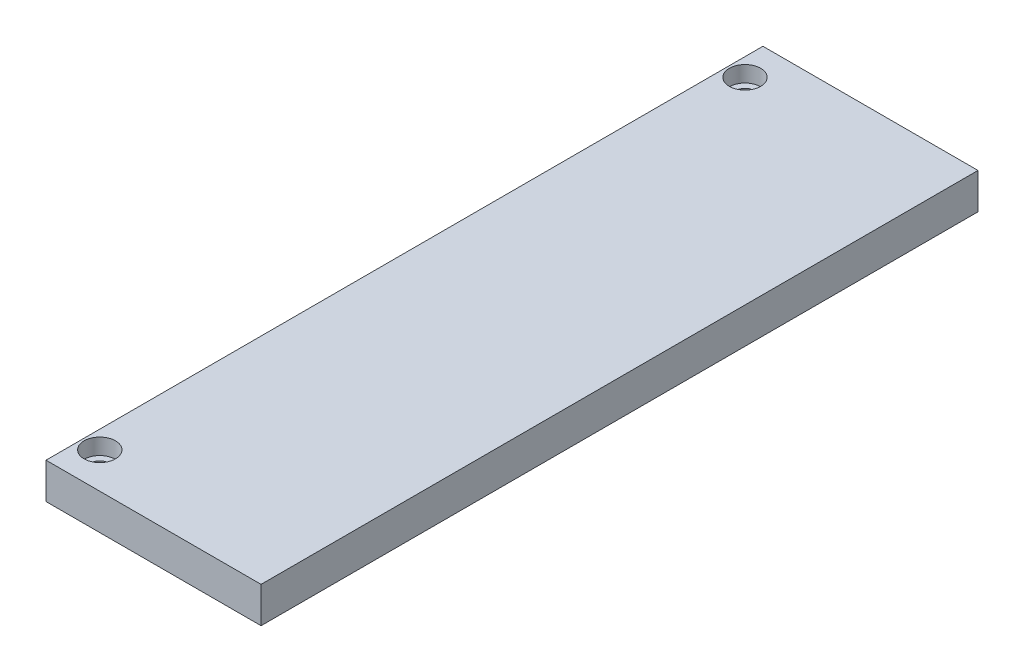
ISO-10303-21;
HEADER;
FILE_DESCRIPTION(('STEP AP214'),'2;1');
FILE_NAME('part.step','',(''),(''),'','','');
FILE_SCHEMA(('AUTOMOTIVE_DESIGN { 1 0 10303 214 1 1 1 1 }'));
ENDSEC;
DATA;
#1=APPLICATION_CONTEXT('core data for automotive mechanical design processes');
#2=APPLICATION_PROTOCOL_DEFINITION('international standard','automotive_design',2000,#1);
#3=PRODUCT_CONTEXT('',#1,'mechanical');
#4=PRODUCT('Part','Part','',(#3));
#5=PRODUCT_RELATED_PRODUCT_CATEGORY('part','',(#4));
#6=PRODUCT_DEFINITION_FORMATION('','',#4);
#7=PRODUCT_DEFINITION_CONTEXT('part definition',#1,'design');
#8=PRODUCT_DEFINITION('design','',#6,#7);
#9=PRODUCT_DEFINITION_SHAPE('','',#8);
#10=(LENGTH_UNIT() NAMED_UNIT(*) SI_UNIT(.MILLI.,.METRE.));
#11=(NAMED_UNIT(*) PLANE_ANGLE_UNIT() SI_UNIT($,.RADIAN.));
#12=(NAMED_UNIT(*) SI_UNIT($,.STERADIAN.) SOLID_ANGLE_UNIT());
#13=UNCERTAINTY_MEASURE_WITH_UNIT(LENGTH_MEASURE(1.E-05),#10,'distance_accuracy_value','');
#14=(GEOMETRIC_REPRESENTATION_CONTEXT(3) GLOBAL_UNCERTAINTY_ASSIGNED_CONTEXT((#13)) GLOBAL_UNIT_ASSIGNED_CONTEXT((#10,
#11,#12)) REPRESENTATION_CONTEXT('',''));
#15=CARTESIAN_POINT('',(0.,0.,0.));
#16=DIRECTION('',(0.,0.,1.));
#17=DIRECTION('',(1.,0.,0.));
#18=AXIS2_PLACEMENT_3D('',#15,#16,#17);
#19=CARTESIAN_POINT('',(19.05,6.35,63.5));
#20=DIRECTION('',(-1.,0.,0.));
#21=DIRECTION('',(0.,0.,1.));
#22=AXIS2_PLACEMENT_3D('',#19,#20,#21);
#23=PLANE('',#22);
#24=DIRECTION('',(0.,0.,-1.));
#25=VECTOR('',#24,1.);
#26=CARTESIAN_POINT('',(19.05,0.,63.5));
#27=LINE('',#26,#25);
#28=CARTESIAN_POINT('',(19.05,0.,63.5));
#29=VERTEX_POINT('',#28);
#30=CARTESIAN_POINT('',(19.05,0.,-63.5));
#31=VERTEX_POINT('',#30);
#32=EDGE_CURVE('E106',#29,#31,#27,.T.);
#33=ORIENTED_EDGE('',*,*,#32,.T.);
#34=DIRECTION('',(0.,-1.,0.));
#35=VECTOR('',#34,1.);
#36=CARTESIAN_POINT('',(19.05,6.35,-63.5));
#37=LINE('',#36,#35);
#38=CARTESIAN_POINT('',(19.05,6.35,-63.5));
#39=VERTEX_POINT('',#38);
#40=EDGE_CURVE('E11',#39,#31,#37,.T.);
#41=ORIENTED_EDGE('',*,*,#40,.F.);
#42=DIRECTION('',(0.,0.,-1.));
#43=VECTOR('',#42,1.);
#44=CARTESIAN_POINT('',(19.05,6.35,63.5));
#45=LINE('',#44,#43);
#46=CARTESIAN_POINT('',(19.05,6.35,63.5));
#47=VERTEX_POINT('',#46);
#48=EDGE_CURVE('E90',#47,#39,#45,.T.);
#49=ORIENTED_EDGE('',*,*,#48,.F.);
#50=DIRECTION('',(0.,-1.,0.));
#51=VECTOR('',#50,1.);
#52=CARTESIAN_POINT('',(19.05,6.35,63.5));
#53=LINE('',#52,#51);
#54=EDGE_CURVE('E102',#47,#29,#53,.T.);
#55=ORIENTED_EDGE('',*,*,#54,.T.);
#56=EDGE_LOOP('',(#33,#41,#49,#55));
#57=FACE_BOUND('',#56,.T.);
#58=ADVANCED_FACE('F38',(#57),#23,.F.);
#59=CARTESIAN_POINT('',(-19.05,6.35,-63.5));
#60=DIRECTION('',(0.,0.,1.));
#61=DIRECTION('',(1.,0.,0.));
#62=AXIS2_PLACEMENT_3D('',#59,#60,#61);
#63=PLANE('',#62);
#64=DIRECTION('',(-1.,0.,0.));
#65=VECTOR('',#64,1.);
#66=CARTESIAN_POINT('',(-19.05,0.,-63.5));
#67=LINE('',#66,#65);
#68=CARTESIAN_POINT('',(-19.05,0.,-63.5));
#69=VERTEX_POINT('',#68);
#70=EDGE_CURVE('E95',#31,#69,#67,.T.);
#71=ORIENTED_EDGE('',*,*,#70,.T.);
#72=DIRECTION('',(0.,-1.,0.));
#73=VECTOR('',#72,1.);
#74=CARTESIAN_POINT('',(-19.05,6.35,-63.5));
#75=LINE('',#74,#73);
#76=CARTESIAN_POINT('',(-19.05,6.35,-63.5));
#77=VERTEX_POINT('',#76);
#78=EDGE_CURVE('E47',#77,#69,#75,.T.);
#79=ORIENTED_EDGE('',*,*,#78,.F.);
#80=DIRECTION('',(-1.,0.,0.));
#81=VECTOR('',#80,1.);
#82=CARTESIAN_POINT('',(-19.05,6.35,-63.5));
#83=LINE('',#82,#81);
#84=EDGE_CURVE('E85',#39,#77,#83,.T.);
#85=ORIENTED_EDGE('',*,*,#84,.F.);
#86=ORIENTED_EDGE('',*,*,#40,.T.);
#87=EDGE_LOOP('',(#71,#79,#85,#86));
#88=FACE_BOUND('',#87,.T.);
#89=ADVANCED_FACE('F94',(#88),#63,.F.);
#90=CARTESIAN_POINT('',(-19.05,6.35,63.5));
#91=DIRECTION('',(1.,0.,0.));
#92=DIRECTION('',(0.,0.,-1.));
#93=AXIS2_PLACEMENT_3D('',#90,#91,#92);
#94=PLANE('',#93);
#95=DIRECTION('',(0.,0.,1.));
#96=VECTOR('',#95,1.);
#97=CARTESIAN_POINT('',(-19.05,0.,63.5));
#98=LINE('',#97,#96);
#99=CARTESIAN_POINT('',(-19.05,0.,63.5));
#100=VERTEX_POINT('',#99);
#101=EDGE_CURVE('E72',#69,#100,#98,.T.);
#102=ORIENTED_EDGE('',*,*,#101,.T.);
#103=DIRECTION('',(0.,-1.,0.));
#104=VECTOR('',#103,1.);
#105=CARTESIAN_POINT('',(-19.05,6.35,63.5));
#106=LINE('',#105,#104);
#107=CARTESIAN_POINT('',(-19.05,6.35,63.5));
#108=VERTEX_POINT('',#107);
#109=EDGE_CURVE('E97',#108,#100,#106,.T.);
#110=ORIENTED_EDGE('',*,*,#109,.F.);
#111=DIRECTION('',(0.,0.,1.));
#112=VECTOR('',#111,1.);
#113=CARTESIAN_POINT('',(-19.05,6.35,63.5));
#114=LINE('',#113,#112);
#115=EDGE_CURVE('E88',#77,#108,#114,.T.);
#116=ORIENTED_EDGE('',*,*,#115,.F.);
#117=ORIENTED_EDGE('',*,*,#78,.T.);
#118=EDGE_LOOP('',(#102,#110,#116,#117));
#119=FACE_BOUND('',#118,.T.);
#120=ADVANCED_FACE('F98',(#119),#94,.F.);
#121=CARTESIAN_POINT('',(-19.05,6.35,63.5));
#122=DIRECTION('',(0.,0.,-1.));
#123=DIRECTION('',(-1.,0.,0.));
#124=AXIS2_PLACEMENT_3D('',#121,#122,#123);
#125=PLANE('',#124);
#126=DIRECTION('',(1.,0.,0.));
#127=VECTOR('',#126,1.);
#128=CARTESIAN_POINT('',(-19.05,0.,63.5));
#129=LINE('',#128,#127);
#130=EDGE_CURVE('E78',#100,#29,#129,.T.);
#131=ORIENTED_EDGE('',*,*,#130,.T.);
#132=ORIENTED_EDGE('',*,*,#54,.F.);
#133=DIRECTION('',(1.,0.,0.));
#134=VECTOR('',#133,1.);
#135=CARTESIAN_POINT('',(-19.05,6.35,63.5));
#136=LINE('',#135,#134);
#137=EDGE_CURVE('E55',#108,#47,#136,.T.);
#138=ORIENTED_EDGE('',*,*,#137,.F.);
#139=ORIENTED_EDGE('',*,*,#109,.T.);
#140=EDGE_LOOP('',(#131,#132,#138,#139));
#141=FACE_BOUND('',#140,.T.);
#142=ADVANCED_FACE('F120',(#141),#125,.F.);
#143=CARTESIAN_POINT('',(0.,6.35,0.));
#144=DIRECTION('',(0.,-1.,0.));
#145=DIRECTION('',(0.,0.,-1.));
#146=AXIS2_PLACEMENT_3D('',#143,#144,#145);
#147=PLANE('',#146);
#148=CARTESIAN_POINT('',(-15.875,6.35,57.15));
#149=DIRECTION('',(0.,1.,0.));
#150=DIRECTION('',(0.,0.,1.));
#151=AXIS2_PLACEMENT_3D('',#148,#149,#150);
#152=CIRCLE('',#151,2.77876);
#153=CARTESIAN_POINT('',(-15.875,6.35,59.92876));
#154=VERTEX_POINT('',#153);
#155=EDGE_CURVE('E154',#154,#154,#152,.T.);
#156=ORIENTED_EDGE('',*,*,#155,.F.);
#157=EDGE_LOOP('',(#156));
#158=FACE_BOUND('',#157,.T.);
#159=CARTESIAN_POINT('',(-15.875,6.35,-57.15));
#160=DIRECTION('',(0.,1.,0.));
#161=DIRECTION('',(0.,0.,1.));
#162=AXIS2_PLACEMENT_3D('',#159,#160,#161);
#163=CIRCLE('',#162,2.77876);
#164=CARTESIAN_POINT('',(-15.875,6.35,-54.37124));
#165=VERTEX_POINT('',#164);
#166=EDGE_CURVE('E138',#165,#165,#163,.T.);
#167=ORIENTED_EDGE('',*,*,#166,.F.);
#168=EDGE_LOOP('',(#167));
#169=FACE_BOUND('',#168,.T.);
#170=ORIENTED_EDGE('',*,*,#48,.T.);
#171=ORIENTED_EDGE('',*,*,#84,.T.);
#172=ORIENTED_EDGE('',*,*,#115,.T.);
#173=ORIENTED_EDGE('',*,*,#137,.T.);
#174=EDGE_LOOP('',(#170,#171,#172,#173));
#175=FACE_BOUND('',#174,.T.);
#176=ADVANCED_FACE('F86',(#158,#169,#175),#147,.F.);
#177=CARTESIAN_POINT('',(0.,0.,0.));
#178=DIRECTION('',(0.,-1.,0.));
#179=DIRECTION('',(0.,0.,-1.));
#180=AXIS2_PLACEMENT_3D('',#177,#178,#179);
#181=PLANE('',#180);
#182=CARTESIAN_POINT('',(-15.875,0.,57.15));
#183=DIRECTION('',(0.,1.,0.));
#184=DIRECTION('',(0.,0.,1.));
#185=AXIS2_PLACEMENT_3D('',#182,#183,#184);
#186=CIRCLE('',#185,1.63195);
#187=CARTESIAN_POINT('',(-15.875,0.,58.78195));
#188=VERTEX_POINT('',#187);
#189=EDGE_CURVE('E142',#188,#188,#186,.T.);
#190=ORIENTED_EDGE('',*,*,#189,.T.);
#191=EDGE_LOOP('',(#190));
#192=FACE_BOUND('',#191,.T.);
#193=CARTESIAN_POINT('',(-15.875,0.,-57.15));
#194=DIRECTION('',(0.,1.,0.));
#195=DIRECTION('',(0.,0.,1.));
#196=AXIS2_PLACEMENT_3D('',#193,#194,#195);
#197=CIRCLE('',#196,1.63195);
#198=CARTESIAN_POINT('',(-15.875,0.,-55.51805));
#199=VERTEX_POINT('',#198);
#200=EDGE_CURVE('E110',#199,#199,#197,.T.);
#201=ORIENTED_EDGE('',*,*,#200,.T.);
#202=EDGE_LOOP('',(#201));
#203=FACE_BOUND('',#202,.T.);
#204=ORIENTED_EDGE('',*,*,#32,.F.);
#205=ORIENTED_EDGE('',*,*,#130,.F.);
#206=ORIENTED_EDGE('',*,*,#101,.F.);
#207=ORIENTED_EDGE('',*,*,#70,.F.);
#208=EDGE_LOOP('',(#204,#205,#206,#207));
#209=FACE_BOUND('',#208,.T.);
#210=ADVANCED_FACE('F123',(#192,#203,#209),#181,.T.);
#211=CARTESIAN_POINT('',(-15.875,6.35,-57.15));
#212=DIRECTION('',(0.,1.,0.));
#213=DIRECTION('',(0.,0.,1.));
#214=AXIS2_PLACEMENT_3D('',#211,#212,#213);
#215=CYLINDRICAL_SURFACE('',#214,1.63195);
#216=ORIENTED_EDGE('',*,*,#200,.F.);
#217=EDGE_LOOP('',(#216));
#218=FACE_BOUND('',#217,.T.);
#219=CARTESIAN_POINT('',(-15.875,3.5052,-57.15));
#220=DIRECTION('',(0.,1.,0.));
#221=DIRECTION('',(0.,0.,1.));
#222=AXIS2_PLACEMENT_3D('',#219,#220,#221);
#223=CIRCLE('',#222,1.63195);
#224=CARTESIAN_POINT('',(-15.875,3.5052,-55.51805));
#225=VERTEX_POINT('',#224);
#226=EDGE_CURVE('E130',#225,#225,#223,.T.);
#227=ORIENTED_EDGE('',*,*,#226,.T.);
#228=EDGE_LOOP('',(#227));
#229=FACE_BOUND('',#228,.T.);
#230=ADVANCED_FACE('F179',(#218,#229),#215,.F.);
#231=CARTESIAN_POINT('',(-14.24305,3.5052,-57.15));
#232=DIRECTION('',(0.,-1.,0.));
#233=DIRECTION('',(0.,0.,-1.));
#234=AXIS2_PLACEMENT_3D('',#231,#232,#233);
#235=PLANE('',#234);
#236=ORIENTED_EDGE('',*,*,#226,.F.);
#237=EDGE_LOOP('',(#236));
#238=FACE_BOUND('',#237,.T.);
#239=CARTESIAN_POINT('',(-15.875,3.5052,-57.15));
#240=DIRECTION('',(0.,1.,0.));
#241=DIRECTION('',(0.,0.,1.));
#242=AXIS2_PLACEMENT_3D('',#239,#240,#241);
#243=CIRCLE('',#242,2.77876);
#244=CARTESIAN_POINT('',(-15.875,3.5052,-54.37124));
#245=VERTEX_POINT('',#244);
#246=EDGE_CURVE('E134',#245,#245,#243,.T.);
#247=ORIENTED_EDGE('',*,*,#246,.T.);
#248=EDGE_LOOP('',(#247));
#249=FACE_BOUND('',#248,.T.);
#250=ADVANCED_FACE('F169',(#238,#249),#235,.F.);
#251=CARTESIAN_POINT('',(-15.875,6.35,-57.15));
#252=DIRECTION('',(0.,1.,0.));
#253=DIRECTION('',(0.,0.,1.));
#254=AXIS2_PLACEMENT_3D('',#251,#252,#253);
#255=CYLINDRICAL_SURFACE('',#254,2.77876);
#256=ORIENTED_EDGE('',*,*,#246,.F.);
#257=EDGE_LOOP('',(#256));
#258=FACE_BOUND('',#257,.T.);
#259=ORIENTED_EDGE('',*,*,#166,.T.);
#260=EDGE_LOOP('',(#259));
#261=FACE_BOUND('',#260,.T.);
#262=ADVANCED_FACE('F166',(#258,#261),#255,.F.);
#263=CARTESIAN_POINT('',(-15.875,6.35,57.15));
#264=DIRECTION('',(0.,1.,0.));
#265=DIRECTION('',(0.,0.,1.));
#266=AXIS2_PLACEMENT_3D('',#263,#264,#265);
#267=CYLINDRICAL_SURFACE('',#266,1.63195);
#268=ORIENTED_EDGE('',*,*,#189,.F.);
#269=EDGE_LOOP('',(#268));
#270=FACE_BOUND('',#269,.T.);
#271=CARTESIAN_POINT('',(-15.875,3.5052,57.15));
#272=DIRECTION('',(0.,1.,0.));
#273=DIRECTION('',(0.,0.,1.));
#274=AXIS2_PLACEMENT_3D('',#271,#272,#273);
#275=CIRCLE('',#274,1.63195);
#276=CARTESIAN_POINT('',(-15.875,3.5052,58.78195));
#277=VERTEX_POINT('',#276);
#278=EDGE_CURVE('E146',#277,#277,#275,.T.);
#279=ORIENTED_EDGE('',*,*,#278,.T.);
#280=EDGE_LOOP('',(#279));
#281=FACE_BOUND('',#280,.T.);
#282=ADVANCED_FACE('F168',(#270,#281),#267,.F.);
#283=CARTESIAN_POINT('',(-14.24305,3.5052,57.15));
#284=DIRECTION('',(0.,-1.,0.));
#285=DIRECTION('',(0.,0.,-1.));
#286=AXIS2_PLACEMENT_3D('',#283,#284,#285);
#287=PLANE('',#286);
#288=ORIENTED_EDGE('',*,*,#278,.F.);
#289=EDGE_LOOP('',(#288));
#290=FACE_BOUND('',#289,.T.);
#291=CARTESIAN_POINT('',(-15.875,3.5052,57.15));
#292=DIRECTION('',(0.,1.,0.));
#293=DIRECTION('',(0.,0.,1.));
#294=AXIS2_PLACEMENT_3D('',#291,#292,#293);
#295=CIRCLE('',#294,2.77876);
#296=CARTESIAN_POINT('',(-15.875,3.5052,59.92876));
#297=VERTEX_POINT('',#296);
#298=EDGE_CURVE('E150',#297,#297,#295,.T.);
#299=ORIENTED_EDGE('',*,*,#298,.T.);
#300=EDGE_LOOP('',(#299));
#301=FACE_BOUND('',#300,.T.);
#302=ADVANCED_FACE('F176',(#290,#301),#287,.F.);
#303=CARTESIAN_POINT('',(-15.875,6.35,57.15));
#304=DIRECTION('',(0.,1.,0.));
#305=DIRECTION('',(0.,0.,1.));
#306=AXIS2_PLACEMENT_3D('',#303,#304,#305);
#307=CYLINDRICAL_SURFACE('',#306,2.77876);
#308=ORIENTED_EDGE('',*,*,#298,.F.);
#309=EDGE_LOOP('',(#308));
#310=FACE_BOUND('',#309,.T.);
#311=ORIENTED_EDGE('',*,*,#155,.T.);
#312=EDGE_LOOP('',(#311));
#313=FACE_BOUND('',#312,.T.);
#314=ADVANCED_FACE('F159',(#310,#313),#307,.F.);
#315=CLOSED_SHELL('',(#58,#89,#120,#142,#176,#210,#230,#250,#262,#282,#302,#314));
#316=MANIFOLD_SOLID_BREP('B2',#315);
#317=ADVANCED_BREP_SHAPE_REPRESENTATION('',(#18,#316),#14);
#318=SHAPE_DEFINITION_REPRESENTATION(#9,#317);
ENDSEC;
END-ISO-10303-21;
